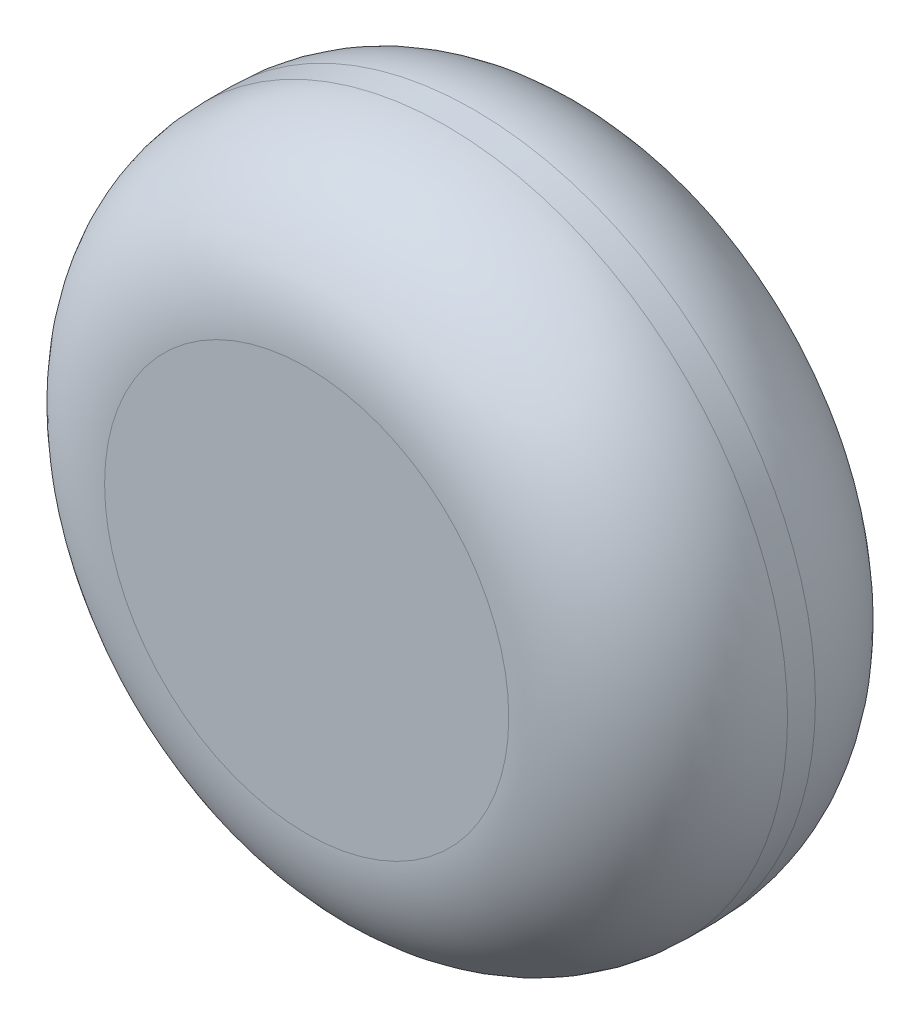
ISO-10303-21;
HEADER;
FILE_DESCRIPTION(('STEP AP214'),'2;1');
FILE_NAME('part.step','',(''),(''),'','','');
FILE_SCHEMA(('AUTOMOTIVE_DESIGN { 1 0 10303 214 1 1 1 1 }'));
ENDSEC;
DATA;
#1=APPLICATION_CONTEXT('core data for automotive mechanical design processes');
#2=APPLICATION_PROTOCOL_DEFINITION('international standard','automotive_design',2000,#1);
#3=PRODUCT_CONTEXT('',#1,'mechanical');
#4=PRODUCT('Part','Part','',(#3));
#5=PRODUCT_RELATED_PRODUCT_CATEGORY('part','',(#4));
#6=PRODUCT_DEFINITION_FORMATION('','',#4);
#7=PRODUCT_DEFINITION_CONTEXT('part definition',#1,'design');
#8=PRODUCT_DEFINITION('design','',#6,#7);
#9=PRODUCT_DEFINITION_SHAPE('','',#8);
#10=(LENGTH_UNIT() NAMED_UNIT(*) SI_UNIT(.MILLI.,.METRE.));
#11=(NAMED_UNIT(*) PLANE_ANGLE_UNIT() SI_UNIT($,.RADIAN.));
#12=(NAMED_UNIT(*) SI_UNIT($,.STERADIAN.) SOLID_ANGLE_UNIT());
#13=UNCERTAINTY_MEASURE_WITH_UNIT(LENGTH_MEASURE(1.E-05),#10,'distance_accuracy_value','');
#14=(GEOMETRIC_REPRESENTATION_CONTEXT(3) GLOBAL_UNCERTAINTY_ASSIGNED_CONTEXT((#13)) GLOBAL_UNIT_ASSIGNED_CONTEXT((#10,
#11,#12)) REPRESENTATION_CONTEXT('',''));
#15=CARTESIAN_POINT('',(0.,0.,0.));
#16=DIRECTION('',(0.,0.,1.));
#17=DIRECTION('',(1.,0.,0.));
#18=AXIS2_PLACEMENT_3D('',#15,#16,#17);
#19=CARTESIAN_POINT('',(0.,0.,11.));
#20=DIRECTION('',(0.,0.,-1.));
#21=DIRECTION('',(-1.,0.,0.));
#22=AXIS2_PLACEMENT_3D('',#19,#20,#21);
#23=CYLINDRICAL_SURFACE('',#22,12.25);
#24=CARTESIAN_POINT('',(0.,0.,5.));
#25=DIRECTION('',(0.,0.,1.));
#26=DIRECTION('',(1.,0.,0.));
#27=AXIS2_PLACEMENT_3D('',#24,#25,#26);
#28=CIRCLE('',#27,12.25);
#29=CARTESIAN_POINT('',(12.25,0.,5.));
#30=VERTEX_POINT('',#29);
#31=EDGE_CURVE('E43',#30,#30,#28,.T.);
#32=ORIENTED_EDGE('',*,*,#31,.T.);
#33=EDGE_LOOP('',(#32));
#34=FACE_BOUND('',#33,.T.);
#35=CARTESIAN_POINT('',(0.,0.,6.));
#36=DIRECTION('',(0.,0.,1.));
#37=DIRECTION('',(1.,0.,0.));
#38=AXIS2_PLACEMENT_3D('',#35,#36,#37);
#39=CIRCLE('',#38,12.25);
#40=CARTESIAN_POINT('',(12.25,0.,6.));
#41=VERTEX_POINT('',#40);
#42=EDGE_CURVE('E47',#41,#41,#39,.F.);
#43=ORIENTED_EDGE('',*,*,#42,.T.);
#44=EDGE_LOOP('',(#43));
#45=FACE_BOUND('',#44,.T.);
#46=ADVANCED_FACE('F32',(#34,#45),#23,.T.);
#47=CARTESIAN_POINT('',(0.,0.,11.));
#48=DIRECTION('',(0.,0.,1.));
#49=DIRECTION('',(1.,0.,0.));
#50=AXIS2_PLACEMENT_3D('',#47,#48,#49);
#51=PLANE('',#50);
#52=CARTESIAN_POINT('',(0.,0.,11.));
#53=DIRECTION('',(0.,0.,1.));
#54=DIRECTION('',(1.,0.,0.));
#55=AXIS2_PLACEMENT_3D('',#52,#53,#54);
#56=CIRCLE('',#55,7.25);
#57=CARTESIAN_POINT('',(7.25,0.,11.));
#58=VERTEX_POINT('',#57);
#59=EDGE_CURVE('E10',#58,#58,#56,.T.);
#60=ORIENTED_EDGE('',*,*,#59,.T.);
#61=EDGE_LOOP('',(#60));
#62=FACE_BOUND('',#61,.T.);
#63=ADVANCED_FACE('F63',(#62),#51,.T.);
#64=CARTESIAN_POINT('',(0.,0.,0.));
#65=DIRECTION('',(0.,0.,1.));
#66=DIRECTION('',(1.,0.,0.));
#67=AXIS2_PLACEMENT_3D('',#64,#65,#66);
#68=PLANE('',#67);
#69=CARTESIAN_POINT('',(0.,0.,0.));
#70=DIRECTION('',(0.,0.,1.));
#71=DIRECTION('',(1.,0.,0.));
#72=AXIS2_PLACEMENT_3D('',#69,#70,#71);
#73=CIRCLE('',#72,7.25);
#74=CARTESIAN_POINT('',(7.25,0.,0.));
#75=VERTEX_POINT('',#74);
#76=EDGE_CURVE('E39',#75,#75,#73,.F.);
#77=ORIENTED_EDGE('',*,*,#76,.T.);
#78=EDGE_LOOP('',(#77));
#79=FACE_BOUND('',#78,.T.);
#80=ADVANCED_FACE('F60',(#79),#68,.F.);
#81=CARTESIAN_POINT('',(0.,0.,5.));
#82=DIRECTION('',(0.,0.,1.));
#83=DIRECTION('',(1.,0.,0.));
#84=AXIS2_PLACEMENT_3D('',#81,#82,#83);
#85=TOROIDAL_SURFACE('',#84,7.25,5.);
#86=ORIENTED_EDGE('',*,*,#76,.F.);
#87=EDGE_LOOP('',(#86));
#88=FACE_BOUND('',#87,.T.);
#89=ORIENTED_EDGE('',*,*,#31,.F.);
#90=EDGE_LOOP('',(#89));
#91=FACE_BOUND('',#90,.T.);
#92=ADVANCED_FACE('F56',(#88,#91),#85,.T.);
#93=CARTESIAN_POINT('',(0.,0.,6.));
#94=DIRECTION('',(0.,0.,1.));
#95=DIRECTION('',(1.,0.,0.));
#96=AXIS2_PLACEMENT_3D('',#93,#94,#95);
#97=TOROIDAL_SURFACE('',#96,7.25,5.);
#98=ORIENTED_EDGE('',*,*,#42,.F.);
#99=EDGE_LOOP('',(#98));
#100=FACE_BOUND('',#99,.T.);
#101=ORIENTED_EDGE('',*,*,#59,.F.);
#102=EDGE_LOOP('',(#101));
#103=FACE_BOUND('',#102,.T.);
#104=ADVANCED_FACE('F34',(#100,#103),#97,.T.);
#105=CLOSED_SHELL('',(#46,#63,#80,#92,#104));
#106=MANIFOLD_SOLID_BREP('B2',#105);
#107=ADVANCED_BREP_SHAPE_REPRESENTATION('',(#18,#106),#14);
#108=SHAPE_DEFINITION_REPRESENTATION(#9,#107);
ENDSEC;
END-ISO-10303-21;
